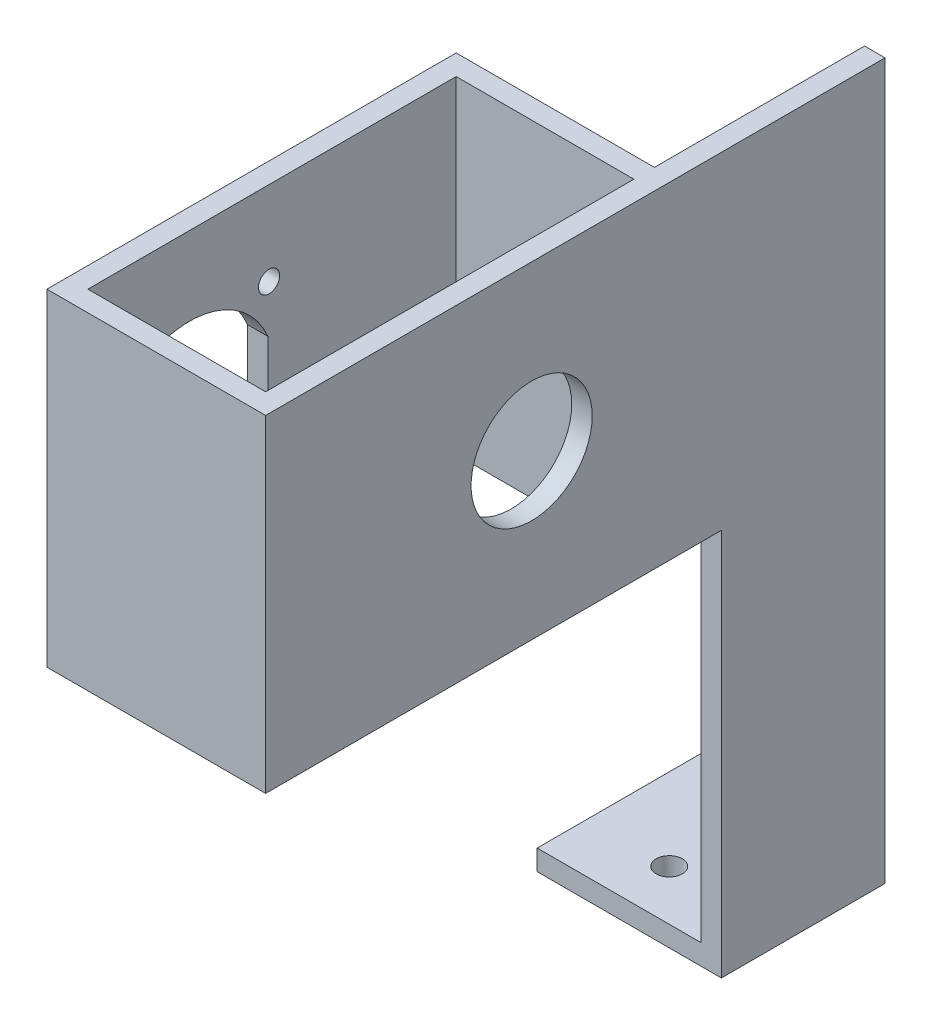
ISO-10303-21;
HEADER;
FILE_DESCRIPTION(('STEP AP214'),'2;1');
FILE_NAME('part.step','',(''),(''),'','','');
FILE_SCHEMA(('AUTOMOTIVE_DESIGN { 1 0 10303 214 1 1 1 1 }'));
ENDSEC;
DATA;
#1=APPLICATION_CONTEXT('core data for automotive mechanical design processes');
#2=APPLICATION_PROTOCOL_DEFINITION('international standard','automotive_design',2000,#1);
#3=PRODUCT_CONTEXT('',#1,'mechanical');
#4=PRODUCT('Part','Part','',(#3));
#5=PRODUCT_RELATED_PRODUCT_CATEGORY('part','',(#4));
#6=PRODUCT_DEFINITION_FORMATION('','',#4);
#7=PRODUCT_DEFINITION_CONTEXT('part definition',#1,'design');
#8=PRODUCT_DEFINITION('design','',#6,#7);
#9=PRODUCT_DEFINITION_SHAPE('','',#8);
#10=(LENGTH_UNIT() NAMED_UNIT(*) SI_UNIT(.MILLI.,.METRE.));
#11=(NAMED_UNIT(*) PLANE_ANGLE_UNIT() SI_UNIT($,.RADIAN.));
#12=(NAMED_UNIT(*) SI_UNIT($,.STERADIAN.) SOLID_ANGLE_UNIT());
#13=UNCERTAINTY_MEASURE_WITH_UNIT(LENGTH_MEASURE(1.E-05),#10,'distance_accuracy_value','');
#14=(GEOMETRIC_REPRESENTATION_CONTEXT(3) GLOBAL_UNCERTAINTY_ASSIGNED_CONTEXT((#13)) GLOBAL_UNIT_ASSIGNED_CONTEXT((#10,
#11,#12)) REPRESENTATION_CONTEXT('',''));
#15=CARTESIAN_POINT('',(0.,0.,0.));
#16=DIRECTION('',(0.,0.,1.));
#17=DIRECTION('',(1.,0.,0.));
#18=AXIS2_PLACEMENT_3D('',#15,#16,#17);
#19=CARTESIAN_POINT('',(-30.7594,12.3743686707646,34.7263686707646));
#20=DIRECTION('',(1.,0.,0.));
#21=DIRECTION('',(0.,0.,-1.));
#22=AXIS2_PLACEMENT_3D('',#19,#20,#21);
#23=CYLINDRICAL_SURFACE('',#22,1.651);
#24=CARTESIAN_POINT('',(-30.7594,12.3743686707646,34.7263686707646));
#25=DIRECTION('',(1.,0.,0.));
#26=DIRECTION('',(0.,0.,-1.));
#27=AXIS2_PLACEMENT_3D('',#24,#25,#26);
#28=CIRCLE('',#27,1.651);
#29=CARTESIAN_POINT('',(-30.7594,12.3743686707646,33.0753686707646));
#30=VERTEX_POINT('',#29);
#31=EDGE_CURVE('E216',#30,#30,#28,.T.);
#32=ORIENTED_EDGE('',*,*,#31,.F.);
#33=EDGE_LOOP('',(#32));
#34=FACE_BOUND('',#33,.T.);
#35=CARTESIAN_POINT('',(-27.5844,12.3743686707646,34.7263686707646));
#36=DIRECTION('',(1.,0.,0.));
#37=DIRECTION('',(0.,0.,-1.));
#38=AXIS2_PLACEMENT_3D('',#35,#36,#37);
#39=CIRCLE('',#38,1.651);
#40=CARTESIAN_POINT('',(-27.5844,12.3743686707646,33.0753686707646));
#41=VERTEX_POINT('',#40);
#42=EDGE_CURVE('E212',#41,#41,#39,.F.);
#43=ORIENTED_EDGE('',*,*,#42,.F.);
#44=EDGE_LOOP('',(#43));
#45=FACE_BOUND('',#44,.T.);
#46=ADVANCED_FACE('F16',(#34,#45),#23,.F.);
#47=CARTESIAN_POINT('',(-30.7594,12.3743686707646,9.97763132923543));
#48=DIRECTION('',(1.,0.,0.));
#49=DIRECTION('',(0.,0.,-1.));
#50=AXIS2_PLACEMENT_3D('',#47,#48,#49);
#51=CYLINDRICAL_SURFACE('',#50,1.651);
#52=CARTESIAN_POINT('',(-30.7594,12.3743686707646,9.97763132923543));
#53=DIRECTION('',(1.,0.,0.));
#54=DIRECTION('',(0.,0.,-1.));
#55=AXIS2_PLACEMENT_3D('',#52,#53,#54);
#56=CIRCLE('',#55,1.651);
#57=CARTESIAN_POINT('',(-30.7594,12.3743686707646,8.32663132923543));
#58=VERTEX_POINT('',#57);
#59=EDGE_CURVE('E219',#58,#58,#56,.T.);
#60=ORIENTED_EDGE('',*,*,#59,.F.);
#61=EDGE_LOOP('',(#60));
#62=FACE_BOUND('',#61,.T.);
#63=CARTESIAN_POINT('',(-27.5844,12.3743686707646,9.97763132923543));
#64=DIRECTION('',(1.,0.,0.));
#65=DIRECTION('',(0.,0.,-1.));
#66=AXIS2_PLACEMENT_3D('',#63,#64,#65);
#67=CIRCLE('',#66,1.651);
#68=CARTESIAN_POINT('',(-27.5844,12.3743686707646,8.32663132923543));
#69=VERTEX_POINT('',#68);
#70=EDGE_CURVE('E209',#69,#69,#67,.F.);
#71=ORIENTED_EDGE('',*,*,#70,.F.);
#72=EDGE_LOOP('',(#71));
#73=FACE_BOUND('',#72,.T.);
#74=ADVANCED_FACE('F231',(#62,#73),#51,.F.);
#75=CARTESIAN_POINT('',(-30.7594,-12.3743686707646,9.97763132923543));
#76=DIRECTION('',(1.,0.,0.));
#77=DIRECTION('',(0.,0.,-1.));
#78=AXIS2_PLACEMENT_3D('',#75,#76,#77);
#79=CYLINDRICAL_SURFACE('',#78,1.651);
#80=CARTESIAN_POINT('',(-30.7594,-12.3743686707646,9.97763132923543));
#81=DIRECTION('',(1.,0.,0.));
#82=DIRECTION('',(0.,0.,-1.));
#83=AXIS2_PLACEMENT_3D('',#80,#81,#82);
#84=CIRCLE('',#83,1.651);
#85=CARTESIAN_POINT('',(-30.7594,-12.3743686707646,8.32663132923543));
#86=VERTEX_POINT('',#85);
#87=EDGE_CURVE('E167',#86,#86,#84,.T.);
#88=ORIENTED_EDGE('',*,*,#87,.F.);
#89=EDGE_LOOP('',(#88));
#90=FACE_BOUND('',#89,.T.);
#91=CARTESIAN_POINT('',(-27.5844,-12.3743686707646,9.97763132923543));
#92=DIRECTION('',(1.,0.,0.));
#93=DIRECTION('',(0.,0.,-1.));
#94=AXIS2_PLACEMENT_3D('',#91,#92,#93);
#95=CIRCLE('',#94,1.651);
#96=CARTESIAN_POINT('',(-27.5844,-12.3743686707646,8.32663132923543));
#97=VERTEX_POINT('',#96);
#98=EDGE_CURVE('E206',#97,#97,#95,.F.);
#99=ORIENTED_EDGE('',*,*,#98,.F.);
#100=EDGE_LOOP('',(#99));
#101=FACE_BOUND('',#100,.T.);
#102=ADVANCED_FACE('F227',(#90,#101),#79,.F.);
#103=CARTESIAN_POINT('',(-30.7594,-12.3743686707646,34.7263686707646));
#104=DIRECTION('',(1.,0.,0.));
#105=DIRECTION('',(0.,0.,-1.));
#106=AXIS2_PLACEMENT_3D('',#103,#104,#105);
#107=CYLINDRICAL_SURFACE('',#106,1.651);
#108=CARTESIAN_POINT('',(-30.7594,-12.3743686707646,34.7263686707646));
#109=DIRECTION('',(1.,0.,0.));
#110=DIRECTION('',(0.,0.,-1.));
#111=AXIS2_PLACEMENT_3D('',#108,#109,#110);
#112=CIRCLE('',#111,1.651);
#113=CARTESIAN_POINT('',(-30.7594,-12.3743686707646,33.0753686707646));
#114=VERTEX_POINT('',#113);
#115=EDGE_CURVE('E164',#114,#114,#112,.T.);
#116=ORIENTED_EDGE('',*,*,#115,.F.);
#117=EDGE_LOOP('',(#116));
#118=FACE_BOUND('',#117,.T.);
#119=CARTESIAN_POINT('',(-27.5844,-12.3743686707646,34.7263686707646));
#120=DIRECTION('',(1.,0.,0.));
#121=DIRECTION('',(0.,0.,-1.));
#122=AXIS2_PLACEMENT_3D('',#119,#120,#121);
#123=CIRCLE('',#122,1.651);
#124=CARTESIAN_POINT('',(-27.5844,-12.3743686707646,33.0753686707646));
#125=VERTEX_POINT('',#124);
#126=EDGE_CURVE('E203',#125,#125,#123,.F.);
#127=ORIENTED_EDGE('',*,*,#126,.F.);
#128=EDGE_LOOP('',(#127));
#129=FACE_BOUND('',#128,.T.);
#130=ADVANCED_FACE('F230',(#118,#129),#107,.F.);
#131=CARTESIAN_POINT('',(-30.7594,0.,22.352));
#132=DIRECTION('',(1.,0.,0.));
#133=DIRECTION('',(0.,0.,-1.));
#134=AXIS2_PLACEMENT_3D('',#131,#132,#133);
#135=CYLINDRICAL_SURFACE('',#134,13.208);
#136=DIRECTION('',(1.,0.,0.));
#137=VECTOR('',#136,1.);
#138=CARTESIAN_POINT('',(-30.7594,-5.08000000000005,34.544));
#139=LINE('',#138,#137);
#140=CARTESIAN_POINT('',(-30.7594,-5.08000000000006,34.544));
#141=VERTEX_POINT('',#140);
#142=CARTESIAN_POINT('',(-27.5844,-5.08000000000006,34.544));
#143=VERTEX_POINT('',#142);
#144=EDGE_CURVE('E176',#141,#143,#139,.T.);
#145=ORIENTED_EDGE('',*,*,#144,.T.);
#146=CARTESIAN_POINT('',(-27.5844,0.,22.352));
#147=DIRECTION('',(1.,0.,0.));
#148=DIRECTION('',(0.,0.,-1.));
#149=AXIS2_PLACEMENT_3D('',#146,#147,#148);
#150=CIRCLE('',#149,13.208);
#151=CARTESIAN_POINT('',(-27.5844,-5.08000000000006,10.16));
#152=VERTEX_POINT('',#151);
#153=EDGE_CURVE('E144',#152,#143,#150,.F.);
#154=ORIENTED_EDGE('',*,*,#153,.F.);
#155=DIRECTION('',(-1.,0.,0.));
#156=VECTOR('',#155,1.);
#157=CARTESIAN_POINT('',(-30.7594,-5.08000000000005,10.16));
#158=LINE('',#157,#156);
#159=CARTESIAN_POINT('',(-30.7594,-5.08000000000006,10.16));
#160=VERTEX_POINT('',#159);
#161=EDGE_CURVE('E140',#152,#160,#158,.T.);
#162=ORIENTED_EDGE('',*,*,#161,.T.);
#163=CARTESIAN_POINT('',(-30.7594,0.,22.352));
#164=DIRECTION('',(1.,0.,0.));
#165=DIRECTION('',(0.,0.,-1.));
#166=AXIS2_PLACEMENT_3D('',#163,#164,#165);
#167=CIRCLE('',#166,13.208);
#168=EDGE_CURVE('E19',#141,#160,#167,.T.);
#169=ORIENTED_EDGE('',*,*,#168,.F.);
#170=EDGE_LOOP('',(#145,#154,#162,#169));
#171=FACE_BOUND('',#170,.T.);
#172=ADVANCED_FACE('F142',(#171),#135,.F.);
#173=CARTESIAN_POINT('',(-30.7594,5.08,34.544));
#174=DIRECTION('',(0.,0.,1.));
#175=DIRECTION('',(1.,0.,0.));
#176=AXIS2_PLACEMENT_3D('',#173,#174,#175);
#177=PLANE('',#176);
#178=DIRECTION('',(1.,0.,0.));
#179=VECTOR('',#178,1.);
#180=CARTESIAN_POINT('',(-30.7594,5.08,34.544));
#181=LINE('',#180,#179);
#182=CARTESIAN_POINT('',(-30.7594,5.08,34.544));
#183=VERTEX_POINT('',#182);
#184=CARTESIAN_POINT('',(-27.5844,5.08,34.544));
#185=VERTEX_POINT('',#184);
#186=EDGE_CURVE('E173',#183,#185,#181,.T.);
#187=ORIENTED_EDGE('',*,*,#186,.T.);
#188=DIRECTION('',(0.,1.,0.));
#189=VECTOR('',#188,1.);
#190=CARTESIAN_POINT('',(-27.5844,0.,34.544));
#191=LINE('',#190,#189);
#192=EDGE_CURVE('E201',#143,#185,#191,.T.);
#193=ORIENTED_EDGE('',*,*,#192,.F.);
#194=ORIENTED_EDGE('',*,*,#144,.F.);
#195=DIRECTION('',(0.,1.,0.));
#196=VECTOR('',#195,1.);
#197=CARTESIAN_POINT('',(-30.7594,0.,34.544));
#198=LINE('',#197,#196);
#199=EDGE_CURVE('E162',#183,#141,#198,.F.);
#200=ORIENTED_EDGE('',*,*,#199,.F.);
#201=EDGE_LOOP('',(#187,#193,#194,#200));
#202=FACE_BOUND('',#201,.T.);
#203=ADVANCED_FACE('F573',(#202),#177,.F.);
#204=CARTESIAN_POINT('',(-30.7594,0.,22.352));
#205=DIRECTION('',(1.,0.,0.));
#206=DIRECTION('',(0.,0.,-1.));
#207=AXIS2_PLACEMENT_3D('',#204,#205,#206);
#208=CYLINDRICAL_SURFACE('',#207,13.208);
#209=DIRECTION('',(-1.,0.,0.));
#210=VECTOR('',#209,1.);
#211=CARTESIAN_POINT('',(-30.7594,5.08,10.16));
#212=LINE('',#211,#210);
#213=CARTESIAN_POINT('',(-30.7594,5.08,10.16));
#214=VERTEX_POINT('',#213);
#215=CARTESIAN_POINT('',(-27.5844,5.08,10.16));
#216=VERTEX_POINT('',#215);
#217=EDGE_CURVE('E148',#214,#216,#212,.F.);
#218=ORIENTED_EDGE('',*,*,#217,.T.);
#219=CARTESIAN_POINT('',(-27.5844,0.,22.352));
#220=DIRECTION('',(1.,0.,0.));
#221=DIRECTION('',(0.,0.,-1.));
#222=AXIS2_PLACEMENT_3D('',#219,#220,#221);
#223=CIRCLE('',#222,13.208);
#224=EDGE_CURVE('E197',#185,#216,#223,.F.);
#225=ORIENTED_EDGE('',*,*,#224,.F.);
#226=ORIENTED_EDGE('',*,*,#186,.F.);
#227=CARTESIAN_POINT('',(-30.7594,0.,22.352));
#228=DIRECTION('',(1.,0.,0.));
#229=DIRECTION('',(0.,0.,-1.));
#230=AXIS2_PLACEMENT_3D('',#227,#228,#229);
#231=CIRCLE('',#230,13.208);
#232=EDGE_CURVE('E156',#214,#183,#231,.T.);
#233=ORIENTED_EDGE('',*,*,#232,.F.);
#234=EDGE_LOOP('',(#218,#225,#226,#233));
#235=FACE_BOUND('',#234,.T.);
#236=ADVANCED_FACE('F565',(#235),#208,.F.);
#237=CARTESIAN_POINT('',(-30.7594,-5.08000000000005,10.16));
#238=DIRECTION('',(0.,0.,-1.));
#239=DIRECTION('',(-1.,0.,0.));
#240=AXIS2_PLACEMENT_3D('',#237,#238,#239);
#241=PLANE('',#240);
#242=ORIENTED_EDGE('',*,*,#161,.F.);
#243=DIRECTION('',(0.,1.,0.));
#244=VECTOR('',#243,1.);
#245=CARTESIAN_POINT('',(-27.5844,0.,10.16));
#246=LINE('',#245,#244);
#247=EDGE_CURVE('E200',#216,#152,#246,.F.);
#248=ORIENTED_EDGE('',*,*,#247,.F.);
#249=ORIENTED_EDGE('',*,*,#217,.F.);
#250=DIRECTION('',(0.,1.,0.));
#251=VECTOR('',#250,1.);
#252=CARTESIAN_POINT('',(-30.7594,0.,10.16));
#253=LINE('',#252,#251);
#254=EDGE_CURVE('E151',#160,#214,#253,.T.);
#255=ORIENTED_EDGE('',*,*,#254,.F.);
#256=EDGE_LOOP('',(#242,#248,#249,#255));
#257=FACE_BOUND('',#256,.T.);
#258=ADVANCED_FACE('F152',(#257),#241,.F.);
#259=CARTESIAN_POINT('',(-30.7594,0.,-20.6375));
#260=DIRECTION('',(-1.,0.,0.));
#261=DIRECTION('',(0.,0.,1.));
#262=AXIS2_PLACEMENT_3D('',#259,#260,#261);
#263=PLANE('',#262);
#264=ORIENTED_EDGE('',*,*,#31,.T.);
#265=EDGE_LOOP('',(#264));
#266=FACE_BOUND('',#265,.T.);
#267=ORIENTED_EDGE('',*,*,#59,.T.);
#268=EDGE_LOOP('',(#267));
#269=FACE_BOUND('',#268,.T.);
#270=ORIENTED_EDGE('',*,*,#87,.T.);
#271=EDGE_LOOP('',(#270));
#272=FACE_BOUND('',#271,.T.);
#273=ORIENTED_EDGE('',*,*,#115,.T.);
#274=EDGE_LOOP('',(#273));
#275=FACE_BOUND('',#274,.T.);
#276=ORIENTED_EDGE('',*,*,#232,.T.);
#277=ORIENTED_EDGE('',*,*,#199,.T.);
#278=ORIENTED_EDGE('',*,*,#168,.T.);
#279=ORIENTED_EDGE('',*,*,#254,.T.);
#280=EDGE_LOOP('',(#276,#277,#278,#279));
#281=FACE_BOUND('',#280,.T.);
#282=DIRECTION('',(0.,0.,-1.));
#283=VECTOR('',#282,1.);
#284=CARTESIAN_POINT('',(-30.7594,-25.4,25.4));
#285=LINE('',#284,#283);
#286=CARTESIAN_POINT('',(-30.7594,-25.4,41.275));
#287=VERTEX_POINT('',#286);
#288=CARTESIAN_POINT('',(-30.7594,-25.4,-22.225));
#289=VERTEX_POINT('',#288);
#290=EDGE_CURVE('E282',#287,#289,#285,.T.);
#291=ORIENTED_EDGE('',*,*,#290,.F.);
#292=DIRECTION('',(0.,-1.,0.));
#293=VECTOR('',#292,1.);
#294=CARTESIAN_POINT('',(-30.7594,-25.4,41.275));
#295=LINE('',#294,#293);
#296=CARTESIAN_POINT('',(-30.7594,25.4,41.275));
#297=VERTEX_POINT('',#296);
#298=EDGE_CURVE('E288',#297,#287,#295,.T.);
#299=ORIENTED_EDGE('',*,*,#298,.F.);
#300=DIRECTION('',(0.,0.,1.));
#301=VECTOR('',#300,1.);
#302=CARTESIAN_POINT('',(-30.7594,25.4000000000003,-317.5));
#303=LINE('',#302,#301);
#304=CARTESIAN_POINT('',(-30.7594,25.4,-22.225));
#305=VERTEX_POINT('',#304);
#306=EDGE_CURVE('E302',#305,#297,#303,.T.);
#307=ORIENTED_EDGE('',*,*,#306,.F.);
#308=DIRECTION('',(0.,1.,0.));
#309=VECTOR('',#308,1.);
#310=CARTESIAN_POINT('',(-30.7594,25.4,-22.225));
#311=LINE('',#310,#309);
#312=EDGE_CURVE('E170',#289,#305,#311,.T.);
#313=ORIENTED_EDGE('',*,*,#312,.F.);
#314=EDGE_LOOP('',(#291,#299,#307,#313));
#315=FACE_BOUND('',#314,.T.);
#316=ADVANCED_FACE('F159',(#266,#269,#272,#275,#281,#315),#263,.T.);
#317=CARTESIAN_POINT('',(0.,25.4,-22.225));
#318=DIRECTION('',(0.,0.,-1.));
#319=DIRECTION('',(0.,1.,0.));
#320=AXIS2_PLACEMENT_3D('',#317,#318,#319);
#321=PLANE('',#320);
#322=DIRECTION('',(1.,0.,0.));
#323=VECTOR('',#322,1.);
#324=CARTESIAN_POINT('',(0.,-25.4,-22.225));
#325=LINE('',#324,#323);
#326=CARTESIAN_POINT('',(0.,-25.4,-22.225));
#327=VERTEX_POINT('',#326);
#328=EDGE_CURVE('E279',#289,#327,#325,.T.);
#329=ORIENTED_EDGE('',*,*,#328,.F.);
#330=ORIENTED_EDGE('',*,*,#312,.T.);
#331=DIRECTION('',(1.,0.,0.));
#332=VECTOR('',#331,1.);
#333=CARTESIAN_POINT('',(0.,25.4000000000001,-22.225));
#334=LINE('',#333,#332);
#335=CARTESIAN_POINT('',(0.,25.4,-22.225));
#336=VERTEX_POINT('',#335);
#337=EDGE_CURVE('E304',#336,#305,#334,.F.);
#338=ORIENTED_EDGE('',*,*,#337,.F.);
#339=DIRECTION('',(0.,1.,0.));
#340=VECTOR('',#339,1.);
#341=CARTESIAN_POINT('',(0.,0.,-22.225));
#342=LINE('',#341,#340);
#343=EDGE_CURVE('E257',#336,#327,#342,.F.);
#344=ORIENTED_EDGE('',*,*,#343,.T.);
#345=EDGE_LOOP('',(#329,#330,#338,#344));
#346=FACE_BOUND('',#345,.T.);
#347=ADVANCED_FACE('F335',(#346),#321,.T.);
#348=CARTESIAN_POINT('',(0.,-25.4,-19.05));
#349=DIRECTION('',(0.,0.,1.));
#350=DIRECTION('',(0.,-1.,0.));
#351=AXIS2_PLACEMENT_3D('',#348,#349,#350);
#352=PLANE('',#351);
#353=DIRECTION('',(0.,1.,0.));
#354=VECTOR('',#353,1.);
#355=CARTESIAN_POINT('',(0.,0.,-19.05));
#356=LINE('',#355,#354);
#357=CARTESIAN_POINT('',(0.,-25.4,-19.05));
#358=VERTEX_POINT('',#357);
#359=CARTESIAN_POINT('',(0.,25.4,-19.05));
#360=VERTEX_POINT('',#359);
#361=EDGE_CURVE('E321',#358,#360,#356,.T.);
#362=ORIENTED_EDGE('',*,*,#361,.T.);
#363=DIRECTION('',(1.,0.,0.));
#364=VECTOR('',#363,1.);
#365=CARTESIAN_POINT('',(0.,25.4000000000001,-19.05));
#366=LINE('',#365,#364);
#367=CARTESIAN_POINT('',(-27.5844,25.4,-19.05));
#368=VERTEX_POINT('',#367);
#369=EDGE_CURVE('E296',#368,#360,#366,.T.);
#370=ORIENTED_EDGE('',*,*,#369,.F.);
#371=DIRECTION('',(0.,1.,0.));
#372=VECTOR('',#371,1.);
#373=CARTESIAN_POINT('',(-27.5844,0.,-19.05));
#374=LINE('',#373,#372);
#375=CARTESIAN_POINT('',(-27.5844,-25.4,-19.05));
#376=VERTEX_POINT('',#375);
#377=EDGE_CURVE('E215',#376,#368,#374,.T.);
#378=ORIENTED_EDGE('',*,*,#377,.F.);
#379=DIRECTION('',(1.,0.,0.));
#380=VECTOR('',#379,1.);
#381=CARTESIAN_POINT('',(0.,-25.4,-19.05));
#382=LINE('',#381,#380);
#383=EDGE_CURVE('E270',#358,#376,#382,.F.);
#384=ORIENTED_EDGE('',*,*,#383,.F.);
#385=EDGE_LOOP('',(#362,#370,#378,#384));
#386=FACE_BOUND('',#385,.T.);
#387=ADVANCED_FACE('F239',(#386),#352,.T.);
#388=CARTESIAN_POINT('',(-27.5844,0.,9.52500000000003));
#389=DIRECTION('',(1.,0.,0.));
#390=DIRECTION('',(0.,0.,-1.));
#391=AXIS2_PLACEMENT_3D('',#388,#389,#390);
#392=PLANE('',#391);
#393=ORIENTED_EDGE('',*,*,#224,.T.);
#394=ORIENTED_EDGE('',*,*,#247,.T.);
#395=ORIENTED_EDGE('',*,*,#153,.T.);
#396=ORIENTED_EDGE('',*,*,#192,.T.);
#397=EDGE_LOOP('',(#393,#394,#395,#396));
#398=FACE_BOUND('',#397,.T.);
#399=ORIENTED_EDGE('',*,*,#126,.T.);
#400=EDGE_LOOP('',(#399));
#401=FACE_BOUND('',#400,.T.);
#402=ORIENTED_EDGE('',*,*,#98,.T.);
#403=EDGE_LOOP('',(#402));
#404=FACE_BOUND('',#403,.T.);
#405=ORIENTED_EDGE('',*,*,#70,.T.);
#406=EDGE_LOOP('',(#405));
#407=FACE_BOUND('',#406,.T.);
#408=ORIENTED_EDGE('',*,*,#42,.T.);
#409=EDGE_LOOP('',(#408));
#410=FACE_BOUND('',#409,.T.);
#411=DIRECTION('',(0.,1.,0.));
#412=VECTOR('',#411,1.);
#413=CARTESIAN_POINT('',(-27.5844,25.4,38.1));
#414=LINE('',#413,#412);
#415=CARTESIAN_POINT('',(-27.5844,-25.4,38.1));
#416=VERTEX_POINT('',#415);
#417=CARTESIAN_POINT('',(-27.5844,25.4,38.1));
#418=VERTEX_POINT('',#417);
#419=EDGE_CURVE('E248',#416,#418,#414,.T.);
#420=ORIENTED_EDGE('',*,*,#419,.F.);
#421=DIRECTION('',(0.,0.,-1.));
#422=VECTOR('',#421,1.);
#423=CARTESIAN_POINT('',(-27.5844,-25.4,25.4));
#424=LINE('',#423,#422);
#425=EDGE_CURVE('E251',#376,#416,#424,.F.);
#426=ORIENTED_EDGE('',*,*,#425,.F.);
#427=ORIENTED_EDGE('',*,*,#377,.T.);
#428=DIRECTION('',(0.,0.,1.));
#429=VECTOR('',#428,1.);
#430=CARTESIAN_POINT('',(-27.5844,25.4000000000003,-317.5));
#431=LINE('',#430,#429);
#432=EDGE_CURVE('E254',#418,#368,#431,.F.);
#433=ORIENTED_EDGE('',*,*,#432,.F.);
#434=EDGE_LOOP('',(#420,#426,#427,#433));
#435=FACE_BOUND('',#434,.T.);
#436=ADVANCED_FACE('F235',(#398,#401,#404,#407,#410,#435),#392,.T.);
#437=CARTESIAN_POINT('',(0.,25.4,38.1));
#438=DIRECTION('',(0.,0.,-1.));
#439=DIRECTION('',(0.,1.,0.));
#440=AXIS2_PLACEMENT_3D('',#437,#438,#439);
#441=PLANE('',#440);
#442=DIRECTION('',(0.,1.,0.));
#443=VECTOR('',#442,1.);
#444=CARTESIAN_POINT('',(0.,0.,38.1));
#445=LINE('',#444,#443);
#446=CARTESIAN_POINT('',(0.,25.4,38.1));
#447=VERTEX_POINT('',#446);
#448=CARTESIAN_POINT('',(0.,-25.4,38.1));
#449=VERTEX_POINT('',#448);
#450=EDGE_CURVE('E192',#447,#449,#445,.F.);
#451=ORIENTED_EDGE('',*,*,#450,.T.);
#452=DIRECTION('',(1.,0.,0.));
#453=VECTOR('',#452,1.);
#454=CARTESIAN_POINT('',(0.,-25.4,38.1));
#455=LINE('',#454,#453);
#456=EDGE_CURVE('E260',#416,#449,#455,.T.);
#457=ORIENTED_EDGE('',*,*,#456,.F.);
#458=ORIENTED_EDGE('',*,*,#419,.T.);
#459=DIRECTION('',(1.,0.,0.));
#460=VECTOR('',#459,1.);
#461=CARTESIAN_POINT('',(0.,25.4000000000001,38.1));
#462=LINE('',#461,#460);
#463=EDGE_CURVE('E300',#447,#418,#462,.F.);
#464=ORIENTED_EDGE('',*,*,#463,.F.);
#465=EDGE_LOOP('',(#451,#457,#458,#464));
#466=FACE_BOUND('',#465,.T.);
#467=ADVANCED_FACE('F238',(#466),#441,.T.);
#468=CARTESIAN_POINT('',(0.,0.,-146.05));
#469=DIRECTION('',(1.,0.,0.));
#470=DIRECTION('',(0.,0.,-1.));
#471=AXIS2_PLACEMENT_3D('',#468,#469,#470);
#472=PLANE('',#471);
#473=DIRECTION('',(0.,0.,1.));
#474=VECTOR('',#473,1.);
#475=CARTESIAN_POINT('',(0.,25.4000000000003,-317.5));
#476=LINE('',#475,#474);
#477=CARTESIAN_POINT('',(0.,25.4,-54.841609519));
#478=VERTEX_POINT('',#477);
#479=EDGE_CURVE('E307',#478,#336,#476,.T.);
#480=ORIENTED_EDGE('',*,*,#479,.F.);
#481=DIRECTION('',(0.,1.,0.));
#482=VECTOR('',#481,1.);
#483=CARTESIAN_POINT('',(0.,-25.4,-54.841609519));
#484=LINE('',#483,#482);
#485=CARTESIAN_POINT('',(0.,-82.3825951024,-54.841609519));
#486=VERTEX_POINT('',#485);
#487=EDGE_CURVE('E313',#486,#478,#484,.T.);
#488=ORIENTED_EDGE('',*,*,#487,.F.);
#489=DIRECTION('',(0.,0.,-1.));
#490=VECTOR('',#489,1.);
#491=CARTESIAN_POINT('',(0.,-82.3825951024,-42.141609519));
#492=LINE('',#491,#490);
#493=CARTESIAN_POINT('',(0.,-82.3825951024,-29.441609519));
#494=VERTEX_POINT('',#493);
#495=EDGE_CURVE('E325',#486,#494,#492,.F.);
#496=ORIENTED_EDGE('',*,*,#495,.T.);
#497=DIRECTION('',(0.,-1.,0.));
#498=VECTOR('',#497,1.);
#499=CARTESIAN_POINT('',(0.,-85.5575951024,-29.441609519));
#500=LINE('',#499,#498);
#501=CARTESIAN_POINT('',(0.,-25.4,-29.441609519));
#502=VERTEX_POINT('',#501);
#503=EDGE_CURVE('E348',#502,#494,#500,.T.);
#504=ORIENTED_EDGE('',*,*,#503,.F.);
#505=DIRECTION('',(0.,0.,-1.));
#506=VECTOR('',#505,1.);
#507=CARTESIAN_POINT('',(0.,-25.4,25.4));
#508=LINE('',#507,#506);
#509=EDGE_CURVE('E277',#327,#502,#508,.T.);
#510=ORIENTED_EDGE('',*,*,#509,.F.);
#511=ORIENTED_EDGE('',*,*,#343,.F.);
#512=EDGE_LOOP('',(#480,#488,#496,#504,#510,#511));
#513=FACE_BOUND('',#512,.T.);
#514=ADVANCED_FACE('F344',(#513),#472,.F.);
#515=CARTESIAN_POINT('',(-12.7,-82.3825951024,-42.141609519));
#516=DIRECTION('',(0.,-1.,0.));
#517=DIRECTION('',(0.,0.,-1.));
#518=AXIS2_PLACEMENT_3D('',#515,#516,#517);
#519=PLANE('',#518);
#520=CARTESIAN_POINT('',(-12.7,-82.3825951024,-37.2309428523334));
#521=DIRECTION('',(0.,-1.,0.));
#522=DIRECTION('',(0.,0.,-1.));
#523=AXIS2_PLACEMENT_3D('',#520,#521,#522);
#524=CIRCLE('',#523,2.032);
#525=CARTESIAN_POINT('',(-12.7,-82.3825951024,-39.2629428523334));
#526=VERTEX_POINT('',#525);
#527=EDGE_CURVE('E193',#526,#526,#524,.T.);
#528=ORIENTED_EDGE('',*,*,#527,.T.);
#529=EDGE_LOOP('',(#528));
#530=FACE_BOUND('',#529,.T.);
#531=CARTESIAN_POINT('',(-12.7,-82.3825951024,-47.0522761856666));
#532=DIRECTION('',(0.,-1.,0.));
#533=DIRECTION('',(0.,0.,-1.));
#534=AXIS2_PLACEMENT_3D('',#531,#532,#533);
#535=CIRCLE('',#534,2.032);
#536=CARTESIAN_POINT('',(-12.7,-82.3825951024,-49.0842761856666));
#537=VERTEX_POINT('',#536);
#538=EDGE_CURVE('E189',#537,#537,#535,.T.);
#539=ORIENTED_EDGE('',*,*,#538,.T.);
#540=EDGE_LOOP('',(#539));
#541=FACE_BOUND('',#540,.T.);
#542=ORIENTED_EDGE('',*,*,#495,.F.);
#543=DIRECTION('',(1.,0.,0.));
#544=VECTOR('',#543,1.);
#545=CARTESIAN_POINT('',(3.175,-82.3825951024,-54.841609519));
#546=LINE('',#545,#544);
#547=CARTESIAN_POINT('',(-25.4,-82.3825951024,-54.841609519));
#548=VERTEX_POINT('',#547);
#549=EDGE_CURVE('E315',#548,#486,#546,.T.);
#550=ORIENTED_EDGE('',*,*,#549,.F.);
#551=DIRECTION('',(0.,0.,-1.));
#552=VECTOR('',#551,1.);
#553=CARTESIAN_POINT('',(-25.4,-82.3825951024,-29.441609519));
#554=LINE('',#553,#552);
#555=CARTESIAN_POINT('',(-25.4,-82.3825951024,-29.441609519));
#556=VERTEX_POINT('',#555);
#557=EDGE_CURVE('E196',#548,#556,#554,.F.);
#558=ORIENTED_EDGE('',*,*,#557,.T.);
#559=DIRECTION('',(1.,0.,0.));
#560=VECTOR('',#559,1.);
#561=CARTESIAN_POINT('',(3.175,-82.3825951024,-29.441609519));
#562=LINE('',#561,#560);
#563=EDGE_CURVE('E379',#494,#556,#562,.F.);
#564=ORIENTED_EDGE('',*,*,#563,.F.);
#565=EDGE_LOOP('',(#542,#550,#558,#564));
#566=FACE_BOUND('',#565,.T.);
#567=ADVANCED_FACE('F391',(#530,#541,#566),#519,.F.);
#568=CARTESIAN_POINT('',(-25.4,-85.5575951024,-29.441609519));
#569=DIRECTION('',(1.,0.,0.));
#570=DIRECTION('',(0.,0.,-1.));
#571=AXIS2_PLACEMENT_3D('',#568,#569,#570);
#572=PLANE('',#571);
#573=DIRECTION('',(0.,-1.,0.));
#574=VECTOR('',#573,1.);
#575=CARTESIAN_POINT('',(-25.4,-85.5575951024,-29.441609519));
#576=LINE('',#575,#574);
#577=CARTESIAN_POINT('',(-25.4,-85.5575951024,-29.441609519));
#578=VERTEX_POINT('',#577);
#579=EDGE_CURVE('E377',#556,#578,#576,.T.);
#580=ORIENTED_EDGE('',*,*,#579,.F.);
#581=ORIENTED_EDGE('',*,*,#557,.F.);
#582=DIRECTION('',(0.,1.,0.));
#583=VECTOR('',#582,1.);
#584=CARTESIAN_POINT('',(-25.4,-25.4,-54.841609519));
#585=LINE('',#584,#583);
#586=CARTESIAN_POINT('',(-25.4,-85.5575951024,-54.841609519));
#587=VERTEX_POINT('',#586);
#588=EDGE_CURVE('E318',#587,#548,#585,.T.);
#589=ORIENTED_EDGE('',*,*,#588,.F.);
#590=DIRECTION('',(0.,0.,-1.));
#591=VECTOR('',#590,1.);
#592=CARTESIAN_POINT('',(-25.4,-85.5575951024,-54.841609519));
#593=LINE('',#592,#591);
#594=EDGE_CURVE('E373',#578,#587,#593,.T.);
#595=ORIENTED_EDGE('',*,*,#594,.F.);
#596=EDGE_LOOP('',(#580,#581,#589,#595));
#597=FACE_BOUND('',#596,.T.);
#598=ADVANCED_FACE('F394',(#597),#572,.F.);
#599=CARTESIAN_POINT('',(-12.7,-85.5575951024,-37.2309428523334));
#600=DIRECTION('',(0.,-1.,0.));
#601=DIRECTION('',(0.,0.,-1.));
#602=AXIS2_PLACEMENT_3D('',#599,#600,#601);
#603=CYLINDRICAL_SURFACE('',#602,2.032);
#604=CARTESIAN_POINT('',(-12.7,-85.5575951024,-37.2309428523334));
#605=DIRECTION('',(0.,-1.,0.));
#606=DIRECTION('',(0.,0.,-1.));
#607=AXIS2_PLACEMENT_3D('',#604,#605,#606);
#608=CIRCLE('',#607,2.032);
#609=CARTESIAN_POINT('',(-12.7,-85.5575951024,-39.2629428523334));
#610=VERTEX_POINT('',#609);
#611=EDGE_CURVE('E185',#610,#610,#608,.F.);
#612=ORIENTED_EDGE('',*,*,#611,.F.);
#613=EDGE_LOOP('',(#612));
#614=FACE_BOUND('',#613,.T.);
#615=ORIENTED_EDGE('',*,*,#527,.F.);
#616=EDGE_LOOP('',(#615));
#617=FACE_BOUND('',#616,.T.);
#618=ADVANCED_FACE('F491',(#614,#617),#603,.F.);
#619=CARTESIAN_POINT('',(-12.7,-85.5575951024,-47.0522761856666));
#620=DIRECTION('',(0.,-1.,0.));
#621=DIRECTION('',(0.,0.,-1.));
#622=AXIS2_PLACEMENT_3D('',#619,#620,#621);
#623=CYLINDRICAL_SURFACE('',#622,2.032);
#624=CARTESIAN_POINT('',(-12.7,-85.5575951024,-47.0522761856666));
#625=DIRECTION('',(0.,-1.,0.));
#626=DIRECTION('',(0.,0.,-1.));
#627=AXIS2_PLACEMENT_3D('',#624,#625,#626);
#628=CIRCLE('',#627,2.032);
#629=CARTESIAN_POINT('',(-12.7,-85.5575951024,-49.0842761856666));
#630=VERTEX_POINT('',#629);
#631=EDGE_CURVE('E182',#630,#630,#628,.F.);
#632=ORIENTED_EDGE('',*,*,#631,.F.);
#633=EDGE_LOOP('',(#632));
#634=FACE_BOUND('',#633,.T.);
#635=ORIENTED_EDGE('',*,*,#538,.F.);
#636=EDGE_LOOP('',(#635));
#637=FACE_BOUND('',#636,.T.);
#638=ADVANCED_FACE('F408',(#634,#637),#623,.F.);
#639=CARTESIAN_POINT('',(0.,0.,-146.05));
#640=DIRECTION('',(1.,0.,0.));
#641=DIRECTION('',(0.,0.,-1.));
#642=AXIS2_PLACEMENT_3D('',#639,#640,#641);
#643=PLANE('',#642);
#644=CARTESIAN_POINT('',(0.,0.,0.));
#645=DIRECTION('',(1.,0.,0.));
#646=DIRECTION('',(0.,0.,-1.));
#647=AXIS2_PLACEMENT_3D('',#644,#645,#646);
#648=CIRCLE('',#647,9.398);
#649=CARTESIAN_POINT('',(0.,0.,-9.398));
#650=VERTEX_POINT('',#649);
#651=EDGE_CURVE('E178',#650,#650,#648,.T.);
#652=ORIENTED_EDGE('',*,*,#651,.T.);
#653=EDGE_LOOP('',(#652));
#654=FACE_BOUND('',#653,.T.);
#655=DIRECTION('',(0.,0.,-1.));
#656=VECTOR('',#655,1.);
#657=CARTESIAN_POINT('',(0.,-25.4,25.4));
#658=LINE('',#657,#656);
#659=EDGE_CURVE('E272',#449,#358,#658,.T.);
#660=ORIENTED_EDGE('',*,*,#659,.F.);
#661=ORIENTED_EDGE('',*,*,#450,.F.);
#662=DIRECTION('',(0.,0.,1.));
#663=VECTOR('',#662,1.);
#664=CARTESIAN_POINT('',(0.,25.4000000000003,-317.5));
#665=LINE('',#664,#663);
#666=EDGE_CURVE('E293',#360,#447,#665,.T.);
#667=ORIENTED_EDGE('',*,*,#666,.F.);
#668=ORIENTED_EDGE('',*,*,#361,.F.);
#669=EDGE_LOOP('',(#660,#661,#667,#668));
#670=FACE_BOUND('',#669,.T.);
#671=ADVANCED_FACE('F399',(#654,#670),#643,.F.);
#672=CARTESIAN_POINT('',(3.175,-25.4,-54.841609519));
#673=DIRECTION('',(0.,0.,-1.));
#674=DIRECTION('',(0.,1.,0.));
#675=AXIS2_PLACEMENT_3D('',#672,#673,#674);
#676=PLANE('',#675);
#677=ORIENTED_EDGE('',*,*,#487,.T.);
#678=DIRECTION('',(1.,0.,0.));
#679=VECTOR('',#678,1.);
#680=CARTESIAN_POINT('',(0.,25.4000000000001,-54.841609519));
#681=LINE('',#680,#679);
#682=CARTESIAN_POINT('',(3.175,25.4,-54.841609519));
#683=VERTEX_POINT('',#682);
#684=EDGE_CURVE('E310',#683,#478,#681,.F.);
#685=ORIENTED_EDGE('',*,*,#684,.F.);
#686=DIRECTION('',(0.,1.,0.));
#687=VECTOR('',#686,1.);
#688=CARTESIAN_POINT('',(3.175,0.,-54.841609519));
#689=LINE('',#688,#687);
#690=CARTESIAN_POINT('',(3.175,-85.5575951024,-54.841609519));
#691=VERTEX_POINT('',#690);
#692=EDGE_CURVE('E181',#691,#683,#689,.T.);
#693=ORIENTED_EDGE('',*,*,#692,.F.);
#694=DIRECTION('',(1.,0.,0.));
#695=VECTOR('',#694,1.);
#696=CARTESIAN_POINT('',(3.175,-85.5575951024,-54.841609519));
#697=LINE('',#696,#695);
#698=EDGE_CURVE('E188',#587,#691,#697,.T.);
#699=ORIENTED_EDGE('',*,*,#698,.F.);
#700=ORIENTED_EDGE('',*,*,#588,.T.);
#701=ORIENTED_EDGE('',*,*,#549,.T.);
#702=EDGE_LOOP('',(#677,#685,#693,#699,#700,#701));
#703=FACE_BOUND('',#702,.T.);
#704=ADVANCED_FACE('F397',(#703),#676,.T.);
#705=CARTESIAN_POINT('',(0.,25.4000000000003,-317.5));
#706=DIRECTION('',(0.,1.,0.));
#707=DIRECTION('',(0.,0.,1.));
#708=AXIS2_PLACEMENT_3D('',#705,#706,#707);
#709=PLANE('',#708);
#710=ORIENTED_EDGE('',*,*,#369,.T.);
#711=ORIENTED_EDGE('',*,*,#666,.T.);
#712=ORIENTED_EDGE('',*,*,#463,.T.);
#713=ORIENTED_EDGE('',*,*,#432,.T.);
#714=EDGE_LOOP('',(#710,#711,#712,#713));
#715=FACE_BOUND('',#714,.T.);
#716=ORIENTED_EDGE('',*,*,#337,.T.);
#717=ORIENTED_EDGE('',*,*,#306,.T.);
#718=DIRECTION('',(1.,0.,0.));
#719=VECTOR('',#718,1.);
#720=CARTESIAN_POINT('',(0.,25.4,41.275));
#721=LINE('',#720,#719);
#722=CARTESIAN_POINT('',(3.175,25.4,41.275));
#723=VERTEX_POINT('',#722);
#724=EDGE_CURVE('E290',#723,#297,#721,.F.);
#725=ORIENTED_EDGE('',*,*,#724,.F.);
#726=DIRECTION('',(0.,0.,-1.));
#727=VECTOR('',#726,1.);
#728=CARTESIAN_POINT('',(3.175,25.4,-146.05));
#729=LINE('',#728,#727);
#730=EDGE_CURVE('E359',#683,#723,#729,.F.);
#731=ORIENTED_EDGE('',*,*,#730,.F.);
#732=ORIENTED_EDGE('',*,*,#684,.T.);
#733=ORIENTED_EDGE('',*,*,#479,.T.);
#734=EDGE_LOOP('',(#716,#717,#725,#731,#732,#733));
#735=FACE_BOUND('',#734,.T.);
#736=ADVANCED_FACE('F339',(#715,#735),#709,.T.);
#737=CARTESIAN_POINT('',(0.,-25.4,41.275));
#738=DIRECTION('',(0.,0.,1.));
#739=DIRECTION('',(0.,-1.,0.));
#740=AXIS2_PLACEMENT_3D('',#737,#738,#739);
#741=PLANE('',#740);
#742=ORIENTED_EDGE('',*,*,#724,.T.);
#743=ORIENTED_EDGE('',*,*,#298,.T.);
#744=DIRECTION('',(1.,0.,0.));
#745=VECTOR('',#744,1.);
#746=CARTESIAN_POINT('',(0.,-25.4,41.275));
#747=LINE('',#746,#745);
#748=CARTESIAN_POINT('',(3.175,-25.4,41.275));
#749=VERTEX_POINT('',#748);
#750=EDGE_CURVE('E285',#749,#287,#747,.F.);
#751=ORIENTED_EDGE('',*,*,#750,.F.);
#752=DIRECTION('',(0.,1.,0.));
#753=VECTOR('',#752,1.);
#754=CARTESIAN_POINT('',(3.175,0.,41.275));
#755=LINE('',#754,#753);
#756=EDGE_CURVE('E357',#723,#749,#755,.F.);
#757=ORIENTED_EDGE('',*,*,#756,.F.);
#758=EDGE_LOOP('',(#742,#743,#751,#757));
#759=FACE_BOUND('',#758,.T.);
#760=ADVANCED_FACE('F356',(#759),#741,.T.);
#761=CARTESIAN_POINT('',(0.,-25.4,25.4));
#762=DIRECTION('',(0.,-1.,0.));
#763=DIRECTION('',(0.,0.,-1.));
#764=AXIS2_PLACEMENT_3D('',#761,#762,#763);
#765=PLANE('',#764);
#766=ORIENTED_EDGE('',*,*,#425,.T.);
#767=ORIENTED_EDGE('',*,*,#456,.T.);
#768=ORIENTED_EDGE('',*,*,#659,.T.);
#769=ORIENTED_EDGE('',*,*,#383,.T.);
#770=EDGE_LOOP('',(#766,#767,#768,#769));
#771=FACE_BOUND('',#770,.T.);
#772=DIRECTION('',(1.,0.,0.));
#773=VECTOR('',#772,1.);
#774=CARTESIAN_POINT('',(3.175,-25.4,-29.441609519));
#775=LINE('',#774,#773);
#776=CARTESIAN_POINT('',(3.175,-25.4,-29.441609519));
#777=VERTEX_POINT('',#776);
#778=EDGE_CURVE('E265',#777,#502,#775,.F.);
#779=ORIENTED_EDGE('',*,*,#778,.F.);
#780=DIRECTION('',(0.,0.,-1.));
#781=VECTOR('',#780,1.);
#782=CARTESIAN_POINT('',(3.175,-25.4,-146.05));
#783=LINE('',#782,#781);
#784=EDGE_CURVE('E352',#749,#777,#783,.T.);
#785=ORIENTED_EDGE('',*,*,#784,.F.);
#786=ORIENTED_EDGE('',*,*,#750,.T.);
#787=ORIENTED_EDGE('',*,*,#290,.T.);
#788=ORIENTED_EDGE('',*,*,#328,.T.);
#789=ORIENTED_EDGE('',*,*,#509,.T.);
#790=EDGE_LOOP('',(#779,#785,#786,#787,#788,#789));
#791=FACE_BOUND('',#790,.T.);
#792=ADVANCED_FACE('F267',(#771,#791),#765,.T.);
#793=CARTESIAN_POINT('',(3.175,-85.5575951024,-29.441609519));
#794=DIRECTION('',(0.,0.,1.));
#795=DIRECTION('',(0.,-1.,0.));
#796=AXIS2_PLACEMENT_3D('',#793,#794,#795);
#797=PLANE('',#796);
#798=ORIENTED_EDGE('',*,*,#579,.T.);
#799=DIRECTION('',(1.,0.,0.));
#800=VECTOR('',#799,1.);
#801=CARTESIAN_POINT('',(3.175,-85.5575951024,-29.441609519));
#802=LINE('',#801,#800);
#803=CARTESIAN_POINT('',(3.175,-85.5575951024,-29.441609519));
#804=VERTEX_POINT('',#803);
#805=EDGE_CURVE('E34',#804,#578,#802,.F.);
#806=ORIENTED_EDGE('',*,*,#805,.F.);
#807=DIRECTION('',(0.,1.,0.));
#808=VECTOR('',#807,1.);
#809=CARTESIAN_POINT('',(3.175,0.,-29.441609519));
#810=LINE('',#809,#808);
#811=EDGE_CURVE('E383',#777,#804,#810,.F.);
#812=ORIENTED_EDGE('',*,*,#811,.F.);
#813=ORIENTED_EDGE('',*,*,#778,.T.);
#814=ORIENTED_EDGE('',*,*,#503,.T.);
#815=ORIENTED_EDGE('',*,*,#563,.T.);
#816=EDGE_LOOP('',(#798,#806,#812,#813,#814,#815));
#817=FACE_BOUND('',#816,.T.);
#818=ADVANCED_FACE('F382',(#817),#797,.T.);
#819=CARTESIAN_POINT('',(3.175,-85.5575951024,-54.841609519));
#820=DIRECTION('',(0.,-1.,0.));
#821=DIRECTION('',(0.,0.,-1.));
#822=AXIS2_PLACEMENT_3D('',#819,#820,#821);
#823=PLANE('',#822);
#824=ORIENTED_EDGE('',*,*,#631,.T.);
#825=EDGE_LOOP('',(#824));
#826=FACE_BOUND('',#825,.T.);
#827=ORIENTED_EDGE('',*,*,#611,.T.);
#828=EDGE_LOOP('',(#827));
#829=FACE_BOUND('',#828,.T.);
#830=ORIENTED_EDGE('',*,*,#594,.T.);
#831=ORIENTED_EDGE('',*,*,#698,.T.);
#832=DIRECTION('',(0.,0.,-1.));
#833=VECTOR('',#832,1.);
#834=CARTESIAN_POINT('',(3.175,-85.5575951024,-146.05));
#835=LINE('',#834,#833);
#836=EDGE_CURVE('E25',#804,#691,#835,.T.);
#837=ORIENTED_EDGE('',*,*,#836,.F.);
#838=ORIENTED_EDGE('',*,*,#805,.T.);
#839=EDGE_LOOP('',(#830,#831,#837,#838));
#840=FACE_BOUND('',#839,.T.);
#841=ADVANCED_FACE('F396',(#826,#829,#840),#823,.T.);
#842=CARTESIAN_POINT('',(0.,0.,0.));
#843=DIRECTION('',(1.,0.,0.));
#844=DIRECTION('',(0.,0.,-1.));
#845=AXIS2_PLACEMENT_3D('',#842,#843,#844);
#846=CYLINDRICAL_SURFACE('',#845,9.398);
#847=ORIENTED_EDGE('',*,*,#651,.F.);
#848=EDGE_LOOP('',(#847));
#849=FACE_BOUND('',#848,.T.);
#850=CARTESIAN_POINT('',(3.175,0.,0.));
#851=DIRECTION('',(1.,0.,0.));
#852=DIRECTION('',(0.,0.,-1.));
#853=AXIS2_PLACEMENT_3D('',#850,#851,#852);
#854=CIRCLE('',#853,9.398);
#855=CARTESIAN_POINT('',(3.175,0.,-9.398));
#856=VERTEX_POINT('',#855);
#857=EDGE_CURVE('E10',#856,#856,#854,.F.);
#858=ORIENTED_EDGE('',*,*,#857,.F.);
#859=EDGE_LOOP('',(#858));
#860=FACE_BOUND('',#859,.T.);
#861=ADVANCED_FACE('F412',(#849,#860),#846,.F.);
#862=CARTESIAN_POINT('',(3.175,0.,-146.05));
#863=DIRECTION('',(1.,0.,0.));
#864=DIRECTION('',(0.,0.,-1.));
#865=AXIS2_PLACEMENT_3D('',#862,#863,#864);
#866=PLANE('',#865);
#867=ORIENTED_EDGE('',*,*,#857,.T.);
#868=EDGE_LOOP('',(#867));
#869=FACE_BOUND('',#868,.T.);
#870=ORIENTED_EDGE('',*,*,#811,.T.);
#871=ORIENTED_EDGE('',*,*,#836,.T.);
#872=ORIENTED_EDGE('',*,*,#692,.T.);
#873=ORIENTED_EDGE('',*,*,#730,.T.);
#874=ORIENTED_EDGE('',*,*,#756,.T.);
#875=ORIENTED_EDGE('',*,*,#784,.T.);
#876=EDGE_LOOP('',(#870,#871,#872,#873,#874,#875));
#877=FACE_BOUND('',#876,.T.);
#878=ADVANCED_FACE('F365',(#869,#877),#866,.T.);
#879=CLOSED_SHELL('',(#46,#74,#102,#130,#172,#203,#236,#258,#316,#347,#387,#436,#467,#514,#567,
#598,#618,#638,#671,#704,#736,#760,#792,#818,#841,#861,#878));
#880=MANIFOLD_SOLID_BREP('B1',#879);
#881=ADVANCED_BREP_SHAPE_REPRESENTATION('',(#18,#880),#14);
#882=SHAPE_DEFINITION_REPRESENTATION(#9,#881);
ENDSEC;
END-ISO-10303-21;
